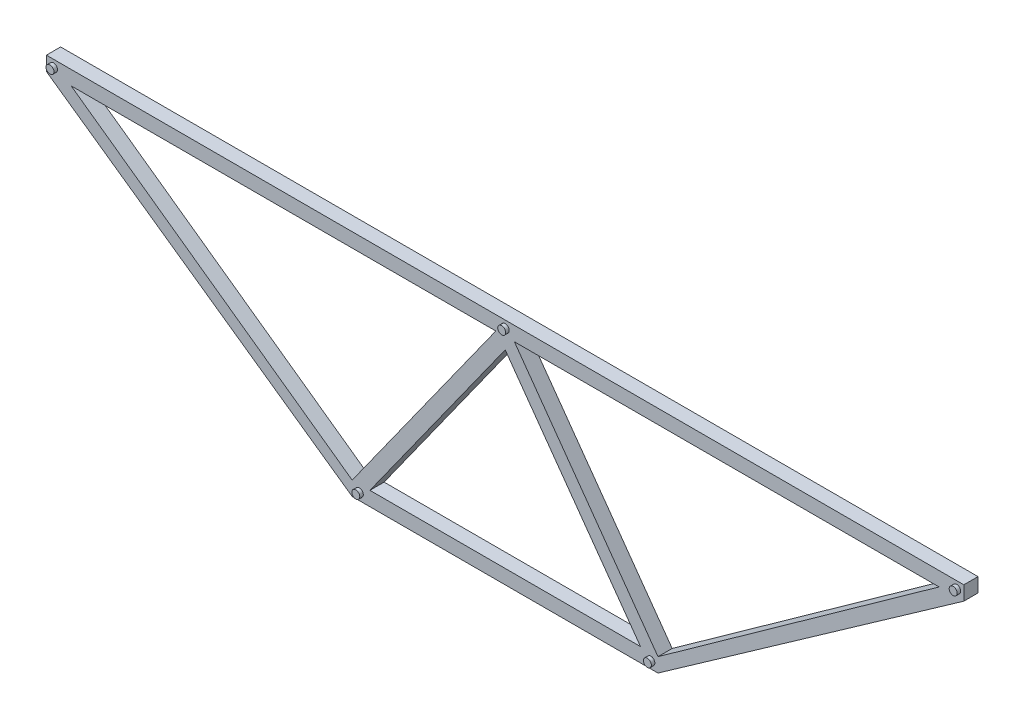
ISO-10303-21;
HEADER;
FILE_DESCRIPTION(('STEP AP214'),'2;1');
FILE_NAME('part.step','',(''),(''),'','','');
FILE_SCHEMA(('AUTOMOTIVE_DESIGN { 1 0 10303 214 1 1 1 1 }'));
ENDSEC;
DATA;
#1=APPLICATION_CONTEXT('core data for automotive mechanical design processes');
#2=APPLICATION_PROTOCOL_DEFINITION('international standard','automotive_design',2000,#1);
#3=PRODUCT_CONTEXT('',#1,'mechanical');
#4=PRODUCT('Part','Part','',(#3));
#5=PRODUCT_RELATED_PRODUCT_CATEGORY('part','',(#4));
#6=PRODUCT_DEFINITION_FORMATION('','',#4);
#7=PRODUCT_DEFINITION_CONTEXT('part definition',#1,'design');
#8=PRODUCT_DEFINITION('design','',#6,#7);
#9=PRODUCT_DEFINITION_SHAPE('','',#8);
#10=(LENGTH_UNIT() NAMED_UNIT(*) SI_UNIT(.MILLI.,.METRE.));
#11=(NAMED_UNIT(*) PLANE_ANGLE_UNIT() SI_UNIT($,.RADIAN.));
#12=(NAMED_UNIT(*) SI_UNIT($,.STERADIAN.) SOLID_ANGLE_UNIT());
#13=UNCERTAINTY_MEASURE_WITH_UNIT(LENGTH_MEASURE(1.E-05),#10,'distance_accuracy_value','');
#14=(GEOMETRIC_REPRESENTATION_CONTEXT(3) GLOBAL_UNCERTAINTY_ASSIGNED_CONTEXT((#13)) GLOBAL_UNIT_ASSIGNED_CONTEXT((#10,
#11,#12)) REPRESENTATION_CONTEXT('',''));
#15=CARTESIAN_POINT('',(0.,0.,0.));
#16=DIRECTION('',(0.,0.,1.));
#17=DIRECTION('',(1.,0.,0.));
#18=AXIS2_PLACEMENT_3D('',#15,#16,#17);
#19=CARTESIAN_POINT('',(0.,0.,18.59));
#20=DIRECTION('',(1.,0.,0.));
#21=DIRECTION('',(0.,1.,0.));
#22=AXIS2_PLACEMENT_3D('',#19,#20,#21);
#23=PLANE('',#22);
#24=DIRECTION('',(0.,-1.,0.));
#25=VECTOR('',#24,1.);
#26=CARTESIAN_POINT('',(0.,0.,0.));
#27=LINE('',#26,#25);
#28=CARTESIAN_POINT('',(0.,0.,0.));
#29=VERTEX_POINT('',#28);
#30=CARTESIAN_POINT('',(0.,-18.59,0.));
#31=VERTEX_POINT('',#30);
#32=EDGE_CURVE('E246',#29,#31,#27,.T.);
#33=ORIENTED_EDGE('',*,*,#32,.T.);
#34=DIRECTION('',(0.,0.,-1.));
#35=VECTOR('',#34,1.);
#36=CARTESIAN_POINT('',(0.,-18.59,18.59));
#37=LINE('',#36,#35);
#38=CARTESIAN_POINT('',(0.,-18.59,18.59));
#39=VERTEX_POINT('',#38);
#40=EDGE_CURVE('E46',#39,#31,#37,.T.);
#41=ORIENTED_EDGE('',*,*,#40,.F.);
#42=DIRECTION('',(0.,-1.,0.));
#43=VECTOR('',#42,1.);
#44=CARTESIAN_POINT('',(0.,0.,18.59));
#45=LINE('',#44,#43);
#46=CARTESIAN_POINT('',(0.,0.,18.59));
#47=VERTEX_POINT('',#46);
#48=EDGE_CURVE('E253',#47,#39,#45,.T.);
#49=ORIENTED_EDGE('',*,*,#48,.F.);
#50=DIRECTION('',(0.,0.,-1.));
#51=VECTOR('',#50,1.);
#52=CARTESIAN_POINT('',(0.,0.,18.59));
#53=LINE('',#52,#51);
#54=EDGE_CURVE('E273',#47,#29,#53,.T.);
#55=ORIENTED_EDGE('',*,*,#54,.T.);
#56=EDGE_LOOP('',(#33,#41,#49,#55));
#57=FACE_BOUND('',#56,.T.);
#58=ADVANCED_FACE('F43',(#57),#23,.F.);
#59=CARTESIAN_POINT('',(0.,-18.59,18.59));
#60=DIRECTION('',(0.57539565097013,0.817875201265242,0.));
#61=DIRECTION('',(-0.817875201265242,0.57539565097013,0.));
#62=AXIS2_PLACEMENT_3D('',#59,#60,#61);
#63=PLANE('',#62);
#64=DIRECTION('',(0.817875201265242,-0.57539565097013,0.));
#65=VECTOR('',#64,1.);
#66=CARTESIAN_POINT('',(0.,-18.59,0.));
#67=LINE('',#66,#65);
#68=CARTESIAN_POINT('',(400.,-300.,0.));
#69=VERTEX_POINT('',#68);
#70=EDGE_CURVE('E277',#31,#69,#67,.T.);
#71=ORIENTED_EDGE('',*,*,#70,.T.);
#72=DIRECTION('',(0.,0.,-1.));
#73=VECTOR('',#72,1.);
#74=CARTESIAN_POINT('',(400.,-300.,18.59));
#75=LINE('',#74,#73);
#76=CARTESIAN_POINT('',(400.,-300.,18.59));
#77=VERTEX_POINT('',#76);
#78=EDGE_CURVE('E305',#77,#69,#75,.T.);
#79=ORIENTED_EDGE('',*,*,#78,.F.);
#80=DIRECTION('',(0.817875201265242,-0.57539565097013,0.));
#81=VECTOR('',#80,1.);
#82=CARTESIAN_POINT('',(0.,-18.59,18.59));
#83=LINE('',#82,#81);
#84=EDGE_CURVE('E257',#39,#77,#83,.T.);
#85=ORIENTED_EDGE('',*,*,#84,.F.);
#86=ORIENTED_EDGE('',*,*,#40,.T.);
#87=EDGE_LOOP('',(#71,#79,#85,#86));
#88=FACE_BOUND('',#87,.T.);
#89=ADVANCED_FACE('F396',(#88),#63,.F.);
#90=CARTESIAN_POINT('',(400.,-300.,18.59));
#91=DIRECTION('',(0.,1.,0.));
#92=DIRECTION('',(0.,0.,1.));
#93=AXIS2_PLACEMENT_3D('',#90,#91,#92);
#94=PLANE('',#93);
#95=DIRECTION('',(1.,0.,0.));
#96=VECTOR('',#95,1.);
#97=CARTESIAN_POINT('',(400.,-300.,0.));
#98=LINE('',#97,#96);
#99=CARTESIAN_POINT('',(800.,-300.,0.));
#100=VERTEX_POINT('',#99);
#101=EDGE_CURVE('E280',#69,#100,#98,.T.);
#102=ORIENTED_EDGE('',*,*,#101,.T.);
#103=DIRECTION('',(0.,0.,-1.));
#104=VECTOR('',#103,1.);
#105=CARTESIAN_POINT('',(800.,-300.,18.59));
#106=LINE('',#105,#104);
#107=CARTESIAN_POINT('',(800.,-300.,18.59));
#108=VERTEX_POINT('',#107);
#109=EDGE_CURVE('E302',#108,#100,#106,.T.);
#110=ORIENTED_EDGE('',*,*,#109,.F.);
#111=DIRECTION('',(1.,0.,0.));
#112=VECTOR('',#111,1.);
#113=CARTESIAN_POINT('',(400.,-300.,18.59));
#114=LINE('',#113,#112);
#115=EDGE_CURVE('E261',#77,#108,#114,.T.);
#116=ORIENTED_EDGE('',*,*,#115,.F.);
#117=ORIENTED_EDGE('',*,*,#78,.T.);
#118=EDGE_LOOP('',(#102,#110,#116,#117));
#119=FACE_BOUND('',#118,.T.);
#120=ADVANCED_FACE('F401',(#119),#94,.F.);
#121=CARTESIAN_POINT('',(800.,-300.,18.59));
#122=DIRECTION('',(-0.57539565097013,0.817875201265242,0.));
#123=DIRECTION('',(-0.817875201265243,-0.57539565097013,0.));
#124=AXIS2_PLACEMENT_3D('',#121,#122,#123);
#125=PLANE('',#124);
#126=DIRECTION('',(0.817875201265242,0.57539565097013,0.));
#127=VECTOR('',#126,1.);
#128=CARTESIAN_POINT('',(800.,-300.,0.));
#129=LINE('',#128,#127);
#130=CARTESIAN_POINT('',(1200.,-18.59,0.));
#131=VERTEX_POINT('',#130);
#132=EDGE_CURVE('E283',#100,#131,#129,.T.);
#133=ORIENTED_EDGE('',*,*,#132,.T.);
#134=DIRECTION('',(0.,0.,-1.));
#135=VECTOR('',#134,1.);
#136=CARTESIAN_POINT('',(1200.,-18.59,18.59));
#137=LINE('',#136,#135);
#138=CARTESIAN_POINT('',(1200.,-18.59,18.59));
#139=VERTEX_POINT('',#138);
#140=EDGE_CURVE('E298',#139,#131,#137,.T.);
#141=ORIENTED_EDGE('',*,*,#140,.F.);
#142=DIRECTION('',(0.817875201265242,0.57539565097013,0.));
#143=VECTOR('',#142,1.);
#144=CARTESIAN_POINT('',(800.,-300.,18.59));
#145=LINE('',#144,#143);
#146=EDGE_CURVE('E264',#108,#139,#145,.T.);
#147=ORIENTED_EDGE('',*,*,#146,.F.);
#148=ORIENTED_EDGE('',*,*,#109,.T.);
#149=EDGE_LOOP('',(#133,#141,#147,#148));
#150=FACE_BOUND('',#149,.T.);
#151=ADVANCED_FACE('F420',(#150),#125,.F.);
#152=CARTESIAN_POINT('',(1200.,-18.59,18.59));
#153=DIRECTION('',(-1.,0.,0.));
#154=DIRECTION('',(0.,0.,1.));
#155=AXIS2_PLACEMENT_3D('',#152,#153,#154);
#156=PLANE('',#155);
#157=DIRECTION('',(0.,1.,0.));
#158=VECTOR('',#157,1.);
#159=CARTESIAN_POINT('',(1200.,-18.59,0.));
#160=LINE('',#159,#158);
#161=CARTESIAN_POINT('',(1200.,0.,0.));
#162=VERTEX_POINT('',#161);
#163=EDGE_CURVE('E286',#131,#162,#160,.T.);
#164=ORIENTED_EDGE('',*,*,#163,.T.);
#165=DIRECTION('',(0.,0.,-1.));
#166=VECTOR('',#165,1.);
#167=CARTESIAN_POINT('',(1200.,0.,18.59));
#168=LINE('',#167,#166);
#169=CARTESIAN_POINT('',(1200.,0.,18.59));
#170=VERTEX_POINT('',#169);
#171=EDGE_CURVE('E294',#170,#162,#168,.T.);
#172=ORIENTED_EDGE('',*,*,#171,.F.);
#173=DIRECTION('',(0.,1.,0.));
#174=VECTOR('',#173,1.);
#175=CARTESIAN_POINT('',(1200.,-18.59,18.59));
#176=LINE('',#175,#174);
#177=EDGE_CURVE('E267',#139,#170,#176,.T.);
#178=ORIENTED_EDGE('',*,*,#177,.F.);
#179=ORIENTED_EDGE('',*,*,#140,.T.);
#180=EDGE_LOOP('',(#164,#172,#178,#179));
#181=FACE_BOUND('',#180,.T.);
#182=ADVANCED_FACE('F418',(#181),#156,.F.);
#183=CARTESIAN_POINT('',(0.,0.,18.59));
#184=DIRECTION('',(0.,-1.,0.));
#185=DIRECTION('',(0.,0.,-1.));
#186=AXIS2_PLACEMENT_3D('',#183,#184,#185);
#187=PLANE('',#186);
#188=DIRECTION('',(-1.,0.,0.));
#189=VECTOR('',#188,1.);
#190=CARTESIAN_POINT('',(0.,0.,0.));
#191=LINE('',#190,#189);
#192=EDGE_CURVE('E258',#162,#29,#191,.T.);
#193=ORIENTED_EDGE('',*,*,#192,.T.);
#194=ORIENTED_EDGE('',*,*,#54,.F.);
#195=DIRECTION('',(-1.,0.,0.));
#196=VECTOR('',#195,1.);
#197=CARTESIAN_POINT('',(0.,0.,18.59));
#198=LINE('',#197,#196);
#199=EDGE_CURVE('E270',#170,#47,#198,.T.);
#200=ORIENTED_EDGE('',*,*,#199,.F.);
#201=ORIENTED_EDGE('',*,*,#171,.T.);
#202=EDGE_LOOP('',(#193,#194,#200,#201));
#203=FACE_BOUND('',#202,.T.);
#204=ADVANCED_FACE('F366',(#203),#187,.F.);
#205=CARTESIAN_POINT('',(0.,0.,18.59));
#206=DIRECTION('',(0.,0.,1.));
#207=DIRECTION('',(1.,0.,0.));
#208=AXIS2_PLACEMENT_3D('',#205,#206,#207);
#209=PLANE('',#208);
#210=CARTESIAN_POINT('',(409.295,-290.705,18.59));
#211=DIRECTION('',(0.,0.,1.));
#212=DIRECTION('',(1.,0.,0.));
#213=AXIS2_PLACEMENT_3D('',#210,#211,#212);
#214=CIRCLE('',#213,5.20699999999986);
#215=CARTESIAN_POINT('',(414.502,-290.705,18.59));
#216=VERTEX_POINT('',#215);
#217=EDGE_CURVE('E11',#216,#216,#214,.T.);
#218=ORIENTED_EDGE('',*,*,#217,.F.);
#219=EDGE_LOOP('',(#218));
#220=FACE_BOUND('',#219,.T.);
#221=CARTESIAN_POINT('',(790.705,-290.705,18.59));
#222=DIRECTION('',(0.,0.,1.));
#223=DIRECTION('',(1.,0.,0.));
#224=AXIS2_PLACEMENT_3D('',#221,#222,#223);
#225=CIRCLE('',#224,5.20699999999998);
#226=CARTESIAN_POINT('',(795.912,-290.705,18.59));
#227=VERTEX_POINT('',#226);
#228=EDGE_CURVE('E52',#227,#227,#225,.T.);
#229=ORIENTED_EDGE('',*,*,#228,.F.);
#230=EDGE_LOOP('',(#229));
#231=FACE_BOUND('',#230,.T.);
#232=CARTESIAN_POINT('',(600.156298082309,-9.295,18.59));
#233=DIRECTION('',(0.,0.,1.));
#234=DIRECTION('',(1.,0.,0.));
#235=AXIS2_PLACEMENT_3D('',#232,#233,#234);
#236=CIRCLE('',#235,5.20699999999998);
#237=CARTESIAN_POINT('',(605.363298082309,-9.295,18.59));
#238=VERTEX_POINT('',#237);
#239=EDGE_CURVE('E325',#238,#238,#236,.T.);
#240=ORIENTED_EDGE('',*,*,#239,.F.);
#241=EDGE_LOOP('',(#240));
#242=FACE_BOUND('',#241,.T.);
#243=CARTESIAN_POINT('',(9.295,-9.295,18.59));
#244=DIRECTION('',(0.,0.,1.));
#245=DIRECTION('',(1.,0.,0.));
#246=AXIS2_PLACEMENT_3D('',#243,#244,#245);
#247=CIRCLE('',#246,5.20699999999998);
#248=CARTESIAN_POINT('',(14.502,-9.295,18.59));
#249=VERTEX_POINT('',#248);
#250=EDGE_CURVE('E319',#249,#249,#247,.T.);
#251=ORIENTED_EDGE('',*,*,#250,.F.);
#252=EDGE_LOOP('',(#251));
#253=FACE_BOUND('',#252,.T.);
#254=CARTESIAN_POINT('',(1190.705,-9.295,18.59));
#255=DIRECTION('',(0.,0.,1.));
#256=DIRECTION('',(1.,0.,0.));
#257=AXIS2_PLACEMENT_3D('',#254,#255,#256);
#258=CIRCLE('',#257,5.20699999999987);
#259=CARTESIAN_POINT('',(1195.912,-9.295,18.59));
#260=VERTEX_POINT('',#259);
#261=EDGE_CURVE('E314',#260,#260,#258,.T.);
#262=ORIENTED_EDGE('',*,*,#261,.F.);
#263=EDGE_LOOP('',(#262));
#264=FACE_BOUND('',#263,.T.);
#265=DIRECTION('',(1.,0.,0.));
#266=VECTOR('',#265,1.);
#267=CARTESIAN_POINT('',(777.149302825359,-281.41,18.59));
#268=LINE('',#267,#266);
#269=CARTESIAN_POINT('',(423.163293339259,-281.41,18.59));
#270=VERTEX_POINT('',#269);
#271=CARTESIAN_POINT('',(777.149302825359,-281.41,18.59));
#272=VERTEX_POINT('',#271);
#273=EDGE_CURVE('E60',#270,#272,#268,.T.);
#274=ORIENTED_EDGE('',*,*,#273,.F.);
#275=DIRECTION('',(-0.581506275255963,-0.813541917689516,0.));
#276=VECTOR('',#275,1.);
#277=CARTESIAN_POINT('',(600.156298082309,-33.7923308133531,18.59));
#278=LINE('',#277,#276);
#279=CARTESIAN_POINT('',(600.156298082309,-33.7923308133531,18.59));
#280=VERTEX_POINT('',#279);
#281=EDGE_CURVE('E198',#280,#270,#278,.T.);
#282=ORIENTED_EDGE('',*,*,#281,.F.);
#283=DIRECTION('',(-0.581506275255964,0.813541917689516,0.));
#284=VECTOR('',#283,1.);
#285=CARTESIAN_POINT('',(777.149302825359,-281.41,18.59));
#286=LINE('',#285,#284);
#287=EDGE_CURVE('E202',#272,#280,#286,.T.);
#288=ORIENTED_EDGE('',*,*,#287,.F.);
#289=EDGE_LOOP('',(#274,#282,#288));
#290=FACE_BOUND('',#289,.T.);
#291=DIRECTION('',(-1.,0.,0.));
#292=VECTOR('',#291,1.);
#293=CARTESIAN_POINT('',(612.140621227215,-18.59,18.59));
#294=LINE('',#293,#292);
#295=CARTESIAN_POINT('',(1167.69179612558,-18.5899999999999,18.59));
#296=VERTEX_POINT('',#295);
#297=CARTESIAN_POINT('',(612.140621227216,-18.59,18.59));
#298=VERTEX_POINT('',#297);
#299=EDGE_CURVE('E68',#296,#298,#294,.T.);
#300=ORIENTED_EDGE('',*,*,#299,.F.);
#301=DIRECTION('',(0.813541917689517,0.581506275255963,0.));
#302=VECTOR('',#301,1.);
#303=CARTESIAN_POINT('',(800.,-281.41,18.59));
#304=LINE('',#303,#302);
#305=CARTESIAN_POINT('',(800.,-281.41,18.59));
#306=VERTEX_POINT('',#305);
#307=EDGE_CURVE('E162',#306,#296,#304,.T.);
#308=ORIENTED_EDGE('',*,*,#307,.F.);
#309=DIRECTION('',(0.581506275255963,-0.813541917689516,0.));
#310=VECTOR('',#309,1.);
#311=CARTESIAN_POINT('',(800.,-281.41,18.59));
#312=LINE('',#311,#310);
#313=EDGE_CURVE('E169',#298,#306,#312,.T.);
#314=ORIENTED_EDGE('',*,*,#313,.F.);
#315=EDGE_LOOP('',(#300,#308,#314));
#316=FACE_BOUND('',#315,.T.);
#317=DIRECTION('',(-1.,0.,0.));
#318=VECTOR('',#317,1.);
#319=CARTESIAN_POINT('',(587.859378772784,-18.5899999999999,18.59));
#320=LINE('',#319,#318);
#321=CARTESIAN_POINT('',(587.859378772784,-18.5899999999999,18.59));
#322=VERTEX_POINT('',#321);
#323=CARTESIAN_POINT('',(32.3082038744242,-18.59,18.59));
#324=VERTEX_POINT('',#323);
#325=EDGE_CURVE('E209',#322,#324,#320,.T.);
#326=ORIENTED_EDGE('',*,*,#325,.F.);
#327=DIRECTION('',(0.581506275255963,0.813541917689516,0.));
#328=VECTOR('',#327,1.);
#329=CARTESIAN_POINT('',(400.,-281.41,18.59));
#330=LINE('',#329,#328);
#331=CARTESIAN_POINT('',(400.,-281.41,18.59));
#332=VERTEX_POINT('',#331);
#333=EDGE_CURVE('E225',#332,#322,#330,.T.);
#334=ORIENTED_EDGE('',*,*,#333,.F.);
#335=DIRECTION('',(0.813541917689516,-0.581506275255964,0.));
#336=VECTOR('',#335,1.);
#337=CARTESIAN_POINT('',(32.3082038744242,-18.59,18.59));
#338=LINE('',#337,#336);
#339=EDGE_CURVE('E236',#324,#332,#338,.T.);
#340=ORIENTED_EDGE('',*,*,#339,.F.);
#341=EDGE_LOOP('',(#326,#334,#340));
#342=FACE_BOUND('',#341,.T.);
#343=ORIENTED_EDGE('',*,*,#48,.T.);
#344=ORIENTED_EDGE('',*,*,#84,.T.);
#345=ORIENTED_EDGE('',*,*,#115,.T.);
#346=ORIENTED_EDGE('',*,*,#146,.T.);
#347=ORIENTED_EDGE('',*,*,#177,.T.);
#348=ORIENTED_EDGE('',*,*,#199,.T.);
#349=EDGE_LOOP('',(#343,#344,#345,#346,#347,#348));
#350=FACE_BOUND('',#349,.T.);
#351=ADVANCED_FACE('F171',(#220,#231,#242,#253,#264,#290,#316,#342,#350),#209,.T.);
#352=CARTESIAN_POINT('',(0.,0.,0.));
#353=DIRECTION('',(0.,0.,1.));
#354=DIRECTION('',(1.,0.,0.));
#355=AXIS2_PLACEMENT_3D('',#352,#353,#354);
#356=PLANE('',#355);
#357=DIRECTION('',(-0.581506275255963,-0.813541917689516,0.));
#358=VECTOR('',#357,1.);
#359=CARTESIAN_POINT('',(600.156298082309,-33.7923308133531,0.));
#360=LINE('',#359,#358);
#361=CARTESIAN_POINT('',(600.156298082309,-33.7923308133531,0.));
#362=VERTEX_POINT('',#361);
#363=CARTESIAN_POINT('',(423.163293339259,-281.41,0.));
#364=VERTEX_POINT('',#363);
#365=EDGE_CURVE('E195',#362,#364,#360,.T.);
#366=ORIENTED_EDGE('',*,*,#365,.T.);
#367=DIRECTION('',(1.,0.,0.));
#368=VECTOR('',#367,1.);
#369=CARTESIAN_POINT('',(777.149302825359,-281.41,0.));
#370=LINE('',#369,#368);
#371=CARTESIAN_POINT('',(777.149302825359,-281.41,0.));
#372=VERTEX_POINT('',#371);
#373=EDGE_CURVE('E203',#364,#372,#370,.T.);
#374=ORIENTED_EDGE('',*,*,#373,.T.);
#375=DIRECTION('',(-0.581506275255964,0.813541917689516,0.));
#376=VECTOR('',#375,1.);
#377=CARTESIAN_POINT('',(777.149302825359,-281.41,0.));
#378=LINE('',#377,#376);
#379=EDGE_CURVE('E213',#372,#362,#378,.T.);
#380=ORIENTED_EDGE('',*,*,#379,.T.);
#381=EDGE_LOOP('',(#366,#374,#380));
#382=FACE_BOUND('',#381,.T.);
#383=DIRECTION('',(0.813541917689517,0.581506275255963,0.));
#384=VECTOR('',#383,1.);
#385=CARTESIAN_POINT('',(800.,-281.41,0.));
#386=LINE('',#385,#384);
#387=CARTESIAN_POINT('',(800.,-281.41,0.));
#388=VERTEX_POINT('',#387);
#389=CARTESIAN_POINT('',(1167.69179612558,-18.5899999999999,0.));
#390=VERTEX_POINT('',#389);
#391=EDGE_CURVE('E182',#388,#390,#386,.T.);
#392=ORIENTED_EDGE('',*,*,#391,.T.);
#393=DIRECTION('',(-1.,0.,0.));
#394=VECTOR('',#393,1.);
#395=CARTESIAN_POINT('',(612.140621227215,-18.59,0.));
#396=LINE('',#395,#394);
#397=CARTESIAN_POINT('',(612.140621227215,-18.59,0.));
#398=VERTEX_POINT('',#397);
#399=EDGE_CURVE('E154',#390,#398,#396,.T.);
#400=ORIENTED_EDGE('',*,*,#399,.T.);
#401=DIRECTION('',(0.581506275255963,-0.813541917689516,0.));
#402=VECTOR('',#401,1.);
#403=CARTESIAN_POINT('',(800.,-281.41,0.));
#404=LINE('',#403,#402);
#405=EDGE_CURVE('E185',#398,#388,#404,.T.);
#406=ORIENTED_EDGE('',*,*,#405,.T.);
#407=EDGE_LOOP('',(#392,#400,#406));
#408=FACE_BOUND('',#407,.T.);
#409=DIRECTION('',(0.581506275255963,0.813541917689516,0.));
#410=VECTOR('',#409,1.);
#411=CARTESIAN_POINT('',(400.,-281.41,0.));
#412=LINE('',#411,#410);
#413=CARTESIAN_POINT('',(400.,-281.41,0.));
#414=VERTEX_POINT('',#413);
#415=CARTESIAN_POINT('',(587.859378772784,-18.5899999999999,0.));
#416=VERTEX_POINT('',#415);
#417=EDGE_CURVE('E229',#414,#416,#412,.T.);
#418=ORIENTED_EDGE('',*,*,#417,.T.);
#419=DIRECTION('',(-1.,0.,0.));
#420=VECTOR('',#419,1.);
#421=CARTESIAN_POINT('',(587.859378772784,-18.5899999999999,0.));
#422=LINE('',#421,#420);
#423=CARTESIAN_POINT('',(32.3082038744242,-18.59,0.));
#424=VERTEX_POINT('',#423);
#425=EDGE_CURVE('E220',#416,#424,#422,.T.);
#426=ORIENTED_EDGE('',*,*,#425,.T.);
#427=DIRECTION('',(0.813541917689516,-0.581506275255964,0.));
#428=VECTOR('',#427,1.);
#429=CARTESIAN_POINT('',(32.3082038744242,-18.59,0.));
#430=LINE('',#429,#428);
#431=EDGE_CURVE('E224',#424,#414,#430,.T.);
#432=ORIENTED_EDGE('',*,*,#431,.T.);
#433=EDGE_LOOP('',(#418,#426,#432));
#434=FACE_BOUND('',#433,.T.);
#435=ORIENTED_EDGE('',*,*,#32,.F.);
#436=ORIENTED_EDGE('',*,*,#192,.F.);
#437=ORIENTED_EDGE('',*,*,#163,.F.);
#438=ORIENTED_EDGE('',*,*,#132,.F.);
#439=ORIENTED_EDGE('',*,*,#101,.F.);
#440=ORIENTED_EDGE('',*,*,#70,.F.);
#441=EDGE_LOOP('',(#435,#436,#437,#438,#439,#440));
#442=FACE_BOUND('',#441,.T.);
#443=ADVANCED_FACE('F365',(#382,#408,#434,#442),#356,.F.);
#444=CARTESIAN_POINT('',(587.859378772784,-18.5899999999999,0.));
#445=DIRECTION('',(0.,1.,0.));
#446=DIRECTION('',(-1.,0.,0.));
#447=AXIS2_PLACEMENT_3D('',#444,#445,#446);
#448=PLANE('',#447);
#449=ORIENTED_EDGE('',*,*,#325,.T.);
#450=DIRECTION('',(0.,0.,1.));
#451=VECTOR('',#450,1.);
#452=CARTESIAN_POINT('',(32.3082038744242,-18.59,0.));
#453=LINE('',#452,#451);
#454=EDGE_CURVE('E233',#424,#324,#453,.T.);
#455=ORIENTED_EDGE('',*,*,#454,.F.);
#456=ORIENTED_EDGE('',*,*,#425,.F.);
#457=DIRECTION('',(0.,0.,1.));
#458=VECTOR('',#457,1.);
#459=CARTESIAN_POINT('',(587.859378772784,-18.5899999999999,0.));
#460=LINE('',#459,#458);
#461=EDGE_CURVE('E243',#416,#322,#460,.T.);
#462=ORIENTED_EDGE('',*,*,#461,.T.);
#463=EDGE_LOOP('',(#449,#455,#456,#462));
#464=FACE_BOUND('',#463,.T.);
#465=ADVANCED_FACE('F433',(#464),#448,.F.);
#466=CARTESIAN_POINT('',(400.,-281.41,0.));
#467=DIRECTION('',(0.813541917689516,-0.581506275255963,0.));
#468=DIRECTION('',(0.581506275255964,0.813541917689516,0.));
#469=AXIS2_PLACEMENT_3D('',#466,#467,#468);
#470=PLANE('',#469);
#471=ORIENTED_EDGE('',*,*,#333,.T.);
#472=ORIENTED_EDGE('',*,*,#461,.F.);
#473=ORIENTED_EDGE('',*,*,#417,.F.);
#474=DIRECTION('',(0.,0.,1.));
#475=VECTOR('',#474,1.);
#476=CARTESIAN_POINT('',(400.,-281.41,0.));
#477=LINE('',#476,#475);
#478=EDGE_CURVE('E247',#414,#332,#477,.T.);
#479=ORIENTED_EDGE('',*,*,#478,.T.);
#480=EDGE_LOOP('',(#471,#472,#473,#479));
#481=FACE_BOUND('',#480,.T.);
#482=ADVANCED_FACE('F437',(#481),#470,.F.);
#483=CARTESIAN_POINT('',(32.3082038744242,-18.59,0.));
#484=DIRECTION('',(-0.581506275255964,-0.813541917689516,0.));
#485=DIRECTION('',(0.813541917689516,-0.581506275255964,0.));
#486=AXIS2_PLACEMENT_3D('',#483,#484,#485);
#487=PLANE('',#486);
#488=ORIENTED_EDGE('',*,*,#339,.T.);
#489=ORIENTED_EDGE('',*,*,#478,.F.);
#490=ORIENTED_EDGE('',*,*,#431,.F.);
#491=ORIENTED_EDGE('',*,*,#454,.T.);
#492=EDGE_LOOP('',(#488,#489,#490,#491));
#493=FACE_BOUND('',#492,.T.);
#494=ADVANCED_FACE('F439',(#493),#487,.F.);
#495=CARTESIAN_POINT('',(612.140621227215,-18.59,0.));
#496=DIRECTION('',(0.,1.,0.));
#497=DIRECTION('',(-1.,0.,0.));
#498=AXIS2_PLACEMENT_3D('',#495,#496,#497);
#499=PLANE('',#498);
#500=ORIENTED_EDGE('',*,*,#299,.T.);
#501=DIRECTION('',(0.,0.,1.));
#502=VECTOR('',#501,1.);
#503=CARTESIAN_POINT('',(612.140621227215,-18.59,0.));
#504=LINE('',#503,#502);
#505=EDGE_CURVE('E186',#398,#298,#504,.T.);
#506=ORIENTED_EDGE('',*,*,#505,.F.);
#507=ORIENTED_EDGE('',*,*,#399,.F.);
#508=DIRECTION('',(0.,0.,1.));
#509=VECTOR('',#508,1.);
#510=CARTESIAN_POINT('',(1167.69179612558,-18.5899999999999,0.));
#511=LINE('',#510,#509);
#512=EDGE_CURVE('E150',#390,#296,#511,.T.);
#513=ORIENTED_EDGE('',*,*,#512,.T.);
#514=EDGE_LOOP('',(#500,#506,#507,#513));
#515=FACE_BOUND('',#514,.T.);
#516=ADVANCED_FACE('F152',(#515),#499,.F.);
#517=CARTESIAN_POINT('',(800.,-281.41,0.));
#518=DIRECTION('',(0.581506275255963,-0.813541917689517,0.));
#519=DIRECTION('',(0.813541917689517,0.581506275255963,0.));
#520=AXIS2_PLACEMENT_3D('',#517,#518,#519);
#521=PLANE('',#520);
#522=ORIENTED_EDGE('',*,*,#307,.T.);
#523=ORIENTED_EDGE('',*,*,#512,.F.);
#524=ORIENTED_EDGE('',*,*,#391,.F.);
#525=DIRECTION('',(0.,0.,1.));
#526=VECTOR('',#525,1.);
#527=CARTESIAN_POINT('',(800.,-281.41,0.));
#528=LINE('',#527,#526);
#529=EDGE_CURVE('E158',#388,#306,#528,.T.);
#530=ORIENTED_EDGE('',*,*,#529,.T.);
#531=EDGE_LOOP('',(#522,#523,#524,#530));
#532=FACE_BOUND('',#531,.T.);
#533=ADVANCED_FACE('F163',(#532),#521,.F.);
#534=CARTESIAN_POINT('',(800.,-281.41,0.));
#535=DIRECTION('',(-0.813541917689516,-0.581506275255963,0.));
#536=DIRECTION('',(0.581506275255963,-0.813541917689516,0.));
#537=AXIS2_PLACEMENT_3D('',#534,#535,#536);
#538=PLANE('',#537);
#539=ORIENTED_EDGE('',*,*,#313,.T.);
#540=ORIENTED_EDGE('',*,*,#529,.F.);
#541=ORIENTED_EDGE('',*,*,#405,.F.);
#542=ORIENTED_EDGE('',*,*,#505,.T.);
#543=EDGE_LOOP('',(#539,#540,#541,#542));
#544=FACE_BOUND('',#543,.T.);
#545=ADVANCED_FACE('F392',(#544),#538,.F.);
#546=CARTESIAN_POINT('',(777.149302825359,-281.41,0.));
#547=DIRECTION('',(0.,-1.,0.));
#548=DIRECTION('',(1.,0.,0.));
#549=AXIS2_PLACEMENT_3D('',#546,#547,#548);
#550=PLANE('',#549);
#551=ORIENTED_EDGE('',*,*,#273,.T.);
#552=DIRECTION('',(0.,0.,1.));
#553=VECTOR('',#552,1.);
#554=CARTESIAN_POINT('',(777.149302825359,-281.41,0.));
#555=LINE('',#554,#553);
#556=EDGE_CURVE('E192',#372,#272,#555,.T.);
#557=ORIENTED_EDGE('',*,*,#556,.F.);
#558=ORIENTED_EDGE('',*,*,#373,.F.);
#559=DIRECTION('',(0.,0.,1.));
#560=VECTOR('',#559,1.);
#561=CARTESIAN_POINT('',(423.163293339259,-281.41,0.));
#562=LINE('',#561,#560);
#563=EDGE_CURVE('E174',#364,#270,#562,.T.);
#564=ORIENTED_EDGE('',*,*,#563,.T.);
#565=EDGE_LOOP('',(#551,#557,#558,#564));
#566=FACE_BOUND('',#565,.T.);
#567=ADVANCED_FACE('F379',(#566),#550,.F.);
#568=CARTESIAN_POINT('',(600.156298082309,-33.7923308133531,0.));
#569=DIRECTION('',(-0.813541917689516,0.581506275255963,0.));
#570=DIRECTION('',(-0.581506275255963,-0.813541917689517,0.));
#571=AXIS2_PLACEMENT_3D('',#568,#569,#570);
#572=PLANE('',#571);
#573=ORIENTED_EDGE('',*,*,#281,.T.);
#574=ORIENTED_EDGE('',*,*,#563,.F.);
#575=ORIENTED_EDGE('',*,*,#365,.F.);
#576=DIRECTION('',(0.,0.,1.));
#577=VECTOR('',#576,1.);
#578=CARTESIAN_POINT('',(600.156298082309,-33.7923308133531,0.));
#579=LINE('',#578,#577);
#580=EDGE_CURVE('E178',#362,#280,#579,.T.);
#581=ORIENTED_EDGE('',*,*,#580,.T.);
#582=EDGE_LOOP('',(#573,#574,#575,#581));
#583=FACE_BOUND('',#582,.T.);
#584=ADVANCED_FACE('F383',(#583),#572,.F.);
#585=CARTESIAN_POINT('',(777.149302825359,-281.41,0.));
#586=DIRECTION('',(0.813541917689516,0.581506275255964,0.));
#587=DIRECTION('',(-0.581506275255964,0.813541917689516,0.));
#588=AXIS2_PLACEMENT_3D('',#585,#586,#587);
#589=PLANE('',#588);
#590=ORIENTED_EDGE('',*,*,#287,.T.);
#591=ORIENTED_EDGE('',*,*,#580,.F.);
#592=ORIENTED_EDGE('',*,*,#379,.F.);
#593=ORIENTED_EDGE('',*,*,#556,.T.);
#594=EDGE_LOOP('',(#590,#591,#592,#593));
#595=FACE_BOUND('',#594,.T.);
#596=ADVANCED_FACE('F376',(#595),#589,.F.);
#597=CARTESIAN_POINT('',(1190.705,-9.295,23.2));
#598=DIRECTION('',(0.,0.,-1.));
#599=DIRECTION('',(-1.,0.,0.));
#600=AXIS2_PLACEMENT_3D('',#597,#598,#599);
#601=CYLINDRICAL_SURFACE('',#600,5.20699999999987);
#602=ORIENTED_EDGE('',*,*,#261,.T.);
#603=EDGE_LOOP('',(#602));
#604=FACE_BOUND('',#603,.T.);
#605=CARTESIAN_POINT('',(1190.705,-9.295,23.2));
#606=DIRECTION('',(0.,0.,-1.));
#607=DIRECTION('',(-1.,0.,0.));
#608=AXIS2_PLACEMENT_3D('',#605,#606,#607);
#609=CIRCLE('',#608,5.20699999999987);
#610=CARTESIAN_POINT('',(1185.498,-9.295,23.2));
#611=VERTEX_POINT('',#610);
#612=EDGE_CURVE('E159',#611,#611,#609,.T.);
#613=ORIENTED_EDGE('',*,*,#612,.T.);
#614=EDGE_LOOP('',(#613));
#615=FACE_BOUND('',#614,.T.);
#616=ADVANCED_FACE('F390',(#604,#615),#601,.T.);
#617=CARTESIAN_POINT('',(1190.705,-9.295,23.2));
#618=DIRECTION('',(0.,0.,-1.));
#619=DIRECTION('',(-1.,0.,0.));
#620=AXIS2_PLACEMENT_3D('',#617,#618,#619);
#621=PLANE('',#620);
#622=ORIENTED_EDGE('',*,*,#612,.F.);
#623=EDGE_LOOP('',(#622));
#624=FACE_BOUND('',#623,.T.);
#625=ADVANCED_FACE('F520',(#624),#621,.F.);
#626=CARTESIAN_POINT('',(9.295,-9.295,23.2));
#627=DIRECTION('',(0.,0.,-1.));
#628=DIRECTION('',(-1.,0.,0.));
#629=AXIS2_PLACEMENT_3D('',#626,#627,#628);
#630=CYLINDRICAL_SURFACE('',#629,5.20699999999998);
#631=ORIENTED_EDGE('',*,*,#250,.T.);
#632=EDGE_LOOP('',(#631));
#633=FACE_BOUND('',#632,.T.);
#634=CARTESIAN_POINT('',(9.295,-9.295,23.2));
#635=DIRECTION('',(0.,0.,-1.));
#636=DIRECTION('',(-1.,0.,0.));
#637=AXIS2_PLACEMENT_3D('',#634,#635,#636);
#638=CIRCLE('',#637,5.20699999999998);
#639=CARTESIAN_POINT('',(4.08800000000002,-9.295,23.2));
#640=VERTEX_POINT('',#639);
#641=EDGE_CURVE('E335',#640,#640,#638,.T.);
#642=ORIENTED_EDGE('',*,*,#641,.T.);
#643=EDGE_LOOP('',(#642));
#644=FACE_BOUND('',#643,.T.);
#645=ADVANCED_FACE('F530',(#633,#644),#630,.T.);
#646=CARTESIAN_POINT('',(9.295,-9.295,23.2));
#647=DIRECTION('',(0.,0.,-1.));
#648=DIRECTION('',(-1.,0.,0.));
#649=AXIS2_PLACEMENT_3D('',#646,#647,#648);
#650=PLANE('',#649);
#651=ORIENTED_EDGE('',*,*,#641,.F.);
#652=EDGE_LOOP('',(#651));
#653=FACE_BOUND('',#652,.T.);
#654=ADVANCED_FACE('F541',(#653),#650,.F.);
#655=CARTESIAN_POINT('',(600.156298082309,-9.295,23.2));
#656=DIRECTION('',(0.,0.,-1.));
#657=DIRECTION('',(-1.,0.,0.));
#658=AXIS2_PLACEMENT_3D('',#655,#656,#657);
#659=CYLINDRICAL_SURFACE('',#658,5.20699999999998);
#660=ORIENTED_EDGE('',*,*,#239,.T.);
#661=EDGE_LOOP('',(#660));
#662=FACE_BOUND('',#661,.T.);
#663=CARTESIAN_POINT('',(600.156298082309,-9.295,23.2));
#664=DIRECTION('',(0.,0.,-1.));
#665=DIRECTION('',(-1.,0.,0.));
#666=AXIS2_PLACEMENT_3D('',#663,#664,#665);
#667=CIRCLE('',#666,5.20699999999998);
#668=CARTESIAN_POINT('',(594.949298082309,-9.295,23.2));
#669=VERTEX_POINT('',#668);
#670=EDGE_CURVE('E338',#669,#669,#667,.T.);
#671=ORIENTED_EDGE('',*,*,#670,.T.);
#672=EDGE_LOOP('',(#671));
#673=FACE_BOUND('',#672,.T.);
#674=ADVANCED_FACE('F360',(#662,#673),#659,.T.);
#675=CARTESIAN_POINT('',(600.156298082309,-9.295,23.2));
#676=DIRECTION('',(0.,0.,-1.));
#677=DIRECTION('',(-1.,0.,0.));
#678=AXIS2_PLACEMENT_3D('',#675,#676,#677);
#679=PLANE('',#678);
#680=ORIENTED_EDGE('',*,*,#670,.F.);
#681=EDGE_LOOP('',(#680));
#682=FACE_BOUND('',#681,.T.);
#683=ADVANCED_FACE('F562',(#682),#679,.F.);
#684=CARTESIAN_POINT('',(790.705,-290.705,23.2));
#685=DIRECTION('',(0.,0.,-1.));
#686=DIRECTION('',(-1.,0.,0.));
#687=AXIS2_PLACEMENT_3D('',#684,#685,#686);
#688=CYLINDRICAL_SURFACE('',#687,5.20699999999998);
#689=ORIENTED_EDGE('',*,*,#228,.T.);
#690=EDGE_LOOP('',(#689));
#691=FACE_BOUND('',#690,.T.);
#692=CARTESIAN_POINT('',(790.705,-290.705,23.2));
#693=DIRECTION('',(0.,0.,-1.));
#694=DIRECTION('',(-1.,0.,0.));
#695=AXIS2_PLACEMENT_3D('',#692,#693,#694);
#696=CIRCLE('',#695,5.20699999999998);
#697=CARTESIAN_POINT('',(785.498,-290.705,23.2));
#698=VERTEX_POINT('',#697);
#699=EDGE_CURVE('E342',#698,#698,#696,.T.);
#700=ORIENTED_EDGE('',*,*,#699,.T.);
#701=EDGE_LOOP('',(#700));
#702=FACE_BOUND('',#701,.T.);
#703=ADVANCED_FACE('F572',(#691,#702),#688,.T.);
#704=CARTESIAN_POINT('',(790.705,-290.705,23.2));
#705=DIRECTION('',(0.,0.,-1.));
#706=DIRECTION('',(-1.,0.,0.));
#707=AXIS2_PLACEMENT_3D('',#704,#705,#706);
#708=PLANE('',#707);
#709=ORIENTED_EDGE('',*,*,#699,.F.);
#710=EDGE_LOOP('',(#709));
#711=FACE_BOUND('',#710,.T.);
#712=ADVANCED_FACE('F583',(#711),#708,.F.);
#713=CARTESIAN_POINT('',(409.295,-290.705,23.2));
#714=DIRECTION('',(0.,0.,-1.));
#715=DIRECTION('',(-1.,0.,0.));
#716=AXIS2_PLACEMENT_3D('',#713,#714,#715);
#717=CYLINDRICAL_SURFACE('',#716,5.20699999999986);
#718=ORIENTED_EDGE('',*,*,#217,.T.);
#719=EDGE_LOOP('',(#718));
#720=FACE_BOUND('',#719,.T.);
#721=CARTESIAN_POINT('',(409.295,-290.705,23.2));
#722=DIRECTION('',(0.,0.,-1.));
#723=DIRECTION('',(-1.,0.,0.));
#724=AXIS2_PLACEMENT_3D('',#721,#722,#723);
#725=CIRCLE('',#724,5.20699999999986);
#726=CARTESIAN_POINT('',(404.088,-290.705,23.2));
#727=VERTEX_POINT('',#726);
#728=EDGE_CURVE('E346',#727,#727,#725,.T.);
#729=ORIENTED_EDGE('',*,*,#728,.T.);
#730=EDGE_LOOP('',(#729));
#731=FACE_BOUND('',#730,.T.);
#732=ADVANCED_FACE('F594',(#720,#731),#717,.T.);
#733=CARTESIAN_POINT('',(409.295,-290.705,23.2));
#734=DIRECTION('',(0.,0.,-1.));
#735=DIRECTION('',(-1.,0.,0.));
#736=AXIS2_PLACEMENT_3D('',#733,#734,#735);
#737=PLANE('',#736);
#738=ORIENTED_EDGE('',*,*,#728,.F.);
#739=EDGE_LOOP('',(#738));
#740=FACE_BOUND('',#739,.T.);
#741=ADVANCED_FACE('F605',(#740),#737,.F.);
#742=CLOSED_SHELL('',(#58,#89,#120,#151,#182,#204,#351,#443,#465,#482,#494,#516,#533,#545,#567,
#584,#596,#616,#625,#645,#654,#674,#683,#703,#712,#732,#741));
#743=MANIFOLD_SOLID_BREP('B2',#742);
#744=ADVANCED_BREP_SHAPE_REPRESENTATION('',(#18,#743),#14);
#745=SHAPE_DEFINITION_REPRESENTATION(#9,#744);
ENDSEC;
END-ISO-10303-21;
